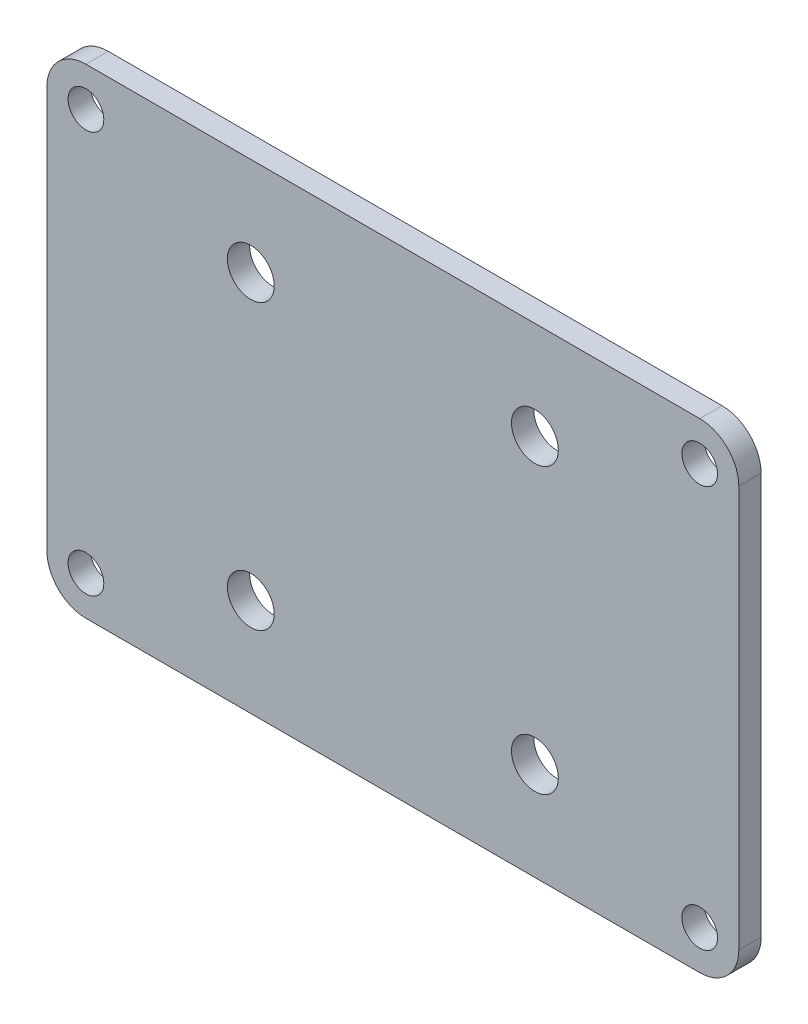
ISO-10303-21;
HEADER;
FILE_DESCRIPTION(('STEP AP214'),'2;1');
FILE_NAME('part.step','',(''),(''),'','','');
FILE_SCHEMA(('AUTOMOTIVE_DESIGN { 1 0 10303 214 1 1 1 1 }'));
ENDSEC;
DATA;
#1=APPLICATION_CONTEXT('core data for automotive mechanical design processes');
#2=APPLICATION_PROTOCOL_DEFINITION('international standard','automotive_design',2000,#1);
#3=PRODUCT_CONTEXT('',#1,'mechanical');
#4=PRODUCT('Part','Part','',(#3));
#5=PRODUCT_RELATED_PRODUCT_CATEGORY('part','',(#4));
#6=PRODUCT_DEFINITION_FORMATION('','',#4);
#7=PRODUCT_DEFINITION_CONTEXT('part definition',#1,'design');
#8=PRODUCT_DEFINITION('design','',#6,#7);
#9=PRODUCT_DEFINITION_SHAPE('','',#8);
#10=(LENGTH_UNIT() NAMED_UNIT(*) SI_UNIT(.MILLI.,.METRE.));
#11=(NAMED_UNIT(*) PLANE_ANGLE_UNIT() SI_UNIT($,.RADIAN.));
#12=(NAMED_UNIT(*) SI_UNIT($,.STERADIAN.) SOLID_ANGLE_UNIT());
#13=UNCERTAINTY_MEASURE_WITH_UNIT(LENGTH_MEASURE(1.E-05),#10,'distance_accuracy_value','');
#14=(GEOMETRIC_REPRESENTATION_CONTEXT(3) GLOBAL_UNCERTAINTY_ASSIGNED_CONTEXT((#13)) GLOBAL_UNIT_ASSIGNED_CONTEXT((#10,
#11,#12)) REPRESENTATION_CONTEXT('',''));
#15=CARTESIAN_POINT('',(0.,0.,0.));
#16=DIRECTION('',(0.,0.,1.));
#17=DIRECTION('',(1.,0.,0.));
#18=AXIS2_PLACEMENT_3D('',#15,#16,#17);
#19=CARTESIAN_POINT('',(0.,0.,2.));
#20=DIRECTION('',(0.,0.,-1.));
#21=DIRECTION('',(-1.,0.,0.));
#22=AXIS2_PLACEMENT_3D('',#19,#20,#21);
#23=PLANE('',#22);
#24=CARTESIAN_POINT('',(-12.7279220613579,12.7279220613578,2.));
#25=DIRECTION('',(0.,0.,1.));
#26=DIRECTION('',(1.,0.,0.));
#27=AXIS2_PLACEMENT_3D('',#24,#25,#26);
#28=CIRCLE('',#27,2.1);
#29=CARTESIAN_POINT('',(-10.6279220613579,12.7279220613578,2.));
#30=VERTEX_POINT('',#29);
#31=EDGE_CURVE('E11',#30,#30,#28,.T.);
#32=ORIENTED_EDGE('',*,*,#31,.F.);
#33=EDGE_LOOP('',(#32));
#34=FACE_BOUND('',#33,.T.);
#35=CARTESIAN_POINT('',(-27.5,-18.,2.));
#36=DIRECTION('',(0.,0.,1.));
#37=DIRECTION('',(1.,0.,0.));
#38=AXIS2_PLACEMENT_3D('',#35,#36,#37);
#39=CIRCLE('',#38,1.6);
#40=CARTESIAN_POINT('',(-25.9,-18.,2.));
#41=VERTEX_POINT('',#40);
#42=EDGE_CURVE('E24',#41,#41,#39,.T.);
#43=ORIENTED_EDGE('',*,*,#42,.F.);
#44=EDGE_LOOP('',(#43));
#45=FACE_BOUND('',#44,.T.);
#46=CARTESIAN_POINT('',(27.5,-18.,2.));
#47=DIRECTION('',(0.,0.,1.));
#48=DIRECTION('',(1.,0.,0.));
#49=AXIS2_PLACEMENT_3D('',#46,#47,#48);
#50=CIRCLE('',#49,1.6);
#51=CARTESIAN_POINT('',(29.1,-18.,2.));
#52=VERTEX_POINT('',#51);
#53=EDGE_CURVE('E179',#52,#52,#50,.T.);
#54=ORIENTED_EDGE('',*,*,#53,.F.);
#55=EDGE_LOOP('',(#54));
#56=FACE_BOUND('',#55,.T.);
#57=CARTESIAN_POINT('',(27.5,18.,2.));
#58=DIRECTION('',(0.,0.,1.));
#59=DIRECTION('',(1.,0.,0.));
#60=AXIS2_PLACEMENT_3D('',#57,#58,#59);
#61=CIRCLE('',#60,1.6);
#62=CARTESIAN_POINT('',(29.1,18.,2.));
#63=VERTEX_POINT('',#62);
#64=EDGE_CURVE('E176',#63,#63,#61,.T.);
#65=ORIENTED_EDGE('',*,*,#64,.F.);
#66=EDGE_LOOP('',(#65));
#67=FACE_BOUND('',#66,.T.);
#68=CARTESIAN_POINT('',(-27.5,18.,2.));
#69=DIRECTION('',(0.,0.,1.));
#70=DIRECTION('',(1.,0.,0.));
#71=AXIS2_PLACEMENT_3D('',#68,#69,#70);
#72=CIRCLE('',#71,1.6);
#73=CARTESIAN_POINT('',(-25.9,18.,2.));
#74=VERTEX_POINT('',#73);
#75=EDGE_CURVE('E173',#74,#74,#72,.T.);
#76=ORIENTED_EDGE('',*,*,#75,.F.);
#77=EDGE_LOOP('',(#76));
#78=FACE_BOUND('',#77,.T.);
#79=CARTESIAN_POINT('',(-12.7279220613579,-12.7279220613578,2.));
#80=DIRECTION('',(0.,0.,1.));
#81=DIRECTION('',(1.,0.,0.));
#82=AXIS2_PLACEMENT_3D('',#79,#80,#81);
#83=CIRCLE('',#82,2.1);
#84=CARTESIAN_POINT('',(-10.6279220613579,-12.7279220613578,2.));
#85=VERTEX_POINT('',#84);
#86=EDGE_CURVE('E170',#85,#85,#83,.T.);
#87=ORIENTED_EDGE('',*,*,#86,.F.);
#88=EDGE_LOOP('',(#87));
#89=FACE_BOUND('',#88,.T.);
#90=CARTESIAN_POINT('',(12.7279220613579,-12.7279220613578,2.));
#91=DIRECTION('',(0.,0.,1.));
#92=DIRECTION('',(1.,0.,0.));
#93=AXIS2_PLACEMENT_3D('',#90,#91,#92);
#94=CIRCLE('',#93,2.1);
#95=CARTESIAN_POINT('',(14.8279220613579,-12.7279220613578,2.));
#96=VERTEX_POINT('',#95);
#97=EDGE_CURVE('E167',#96,#96,#94,.T.);
#98=ORIENTED_EDGE('',*,*,#97,.F.);
#99=EDGE_LOOP('',(#98));
#100=FACE_BOUND('',#99,.T.);
#101=CARTESIAN_POINT('',(12.7279220613579,12.7279220613578,2.));
#102=DIRECTION('',(0.,0.,1.));
#103=DIRECTION('',(1.,0.,0.));
#104=AXIS2_PLACEMENT_3D('',#101,#102,#103);
#105=CIRCLE('',#104,2.1);
#106=CARTESIAN_POINT('',(14.8279220613579,12.7279220613578,2.));
#107=VERTEX_POINT('',#106);
#108=EDGE_CURVE('E164',#107,#107,#105,.T.);
#109=ORIENTED_EDGE('',*,*,#108,.F.);
#110=EDGE_LOOP('',(#109));
#111=FACE_BOUND('',#110,.T.);
#112=DIRECTION('',(0.,-1.,0.));
#113=VECTOR('',#112,1.);
#114=CARTESIAN_POINT('',(-31.,0.,2.));
#115=LINE('',#114,#113);
#116=CARTESIAN_POINT('',(-31.,18.,2.));
#117=VERTEX_POINT('',#116);
#118=CARTESIAN_POINT('',(-31.,-18.,2.));
#119=VERTEX_POINT('',#118);
#120=EDGE_CURVE('E31',#117,#119,#115,.T.);
#121=ORIENTED_EDGE('',*,*,#120,.T.);
#122=CARTESIAN_POINT('',(-27.5,-18.,2.));
#123=DIRECTION('',(0.,0.,-1.));
#124=DIRECTION('',(-1.,0.,0.));
#125=AXIS2_PLACEMENT_3D('',#122,#123,#124);
#126=CIRCLE('',#125,3.5);
#127=CARTESIAN_POINT('',(-27.5,-21.5,2.));
#128=VERTEX_POINT('',#127);
#129=EDGE_CURVE('E36',#119,#128,#126,.F.);
#130=ORIENTED_EDGE('',*,*,#129,.T.);
#131=DIRECTION('',(-1.,0.,0.));
#132=VECTOR('',#131,1.);
#133=CARTESIAN_POINT('',(0.,-21.5,2.));
#134=LINE('',#133,#132);
#135=CARTESIAN_POINT('',(27.5,-21.5,2.));
#136=VERTEX_POINT('',#135);
#137=EDGE_CURVE('E160',#136,#128,#134,.T.);
#138=ORIENTED_EDGE('',*,*,#137,.F.);
#139=CARTESIAN_POINT('',(27.5,-18.,2.));
#140=DIRECTION('',(0.,0.,-1.));
#141=DIRECTION('',(-1.,0.,0.));
#142=AXIS2_PLACEMENT_3D('',#139,#140,#141);
#143=CIRCLE('',#142,3.5);
#144=CARTESIAN_POINT('',(31.,-18.,2.));
#145=VERTEX_POINT('',#144);
#146=EDGE_CURVE('E104',#136,#145,#143,.F.);
#147=ORIENTED_EDGE('',*,*,#146,.T.);
#148=DIRECTION('',(0.,-1.,0.));
#149=VECTOR('',#148,1.);
#150=CARTESIAN_POINT('',(31.,0.,2.));
#151=LINE('',#150,#149);
#152=CARTESIAN_POINT('',(31.,18.,2.));
#153=VERTEX_POINT('',#152);
#154=EDGE_CURVE('E156',#153,#145,#151,.T.);
#155=ORIENTED_EDGE('',*,*,#154,.F.);
#156=CARTESIAN_POINT('',(27.5,18.,2.));
#157=DIRECTION('',(0.,0.,-1.));
#158=DIRECTION('',(-1.,0.,0.));
#159=AXIS2_PLACEMENT_3D('',#156,#157,#158);
#160=CIRCLE('',#159,3.5);
#161=CARTESIAN_POINT('',(27.5,21.5,2.));
#162=VERTEX_POINT('',#161);
#163=EDGE_CURVE('E154',#153,#162,#160,.F.);
#164=ORIENTED_EDGE('',*,*,#163,.T.);
#165=DIRECTION('',(-1.,0.,0.));
#166=VECTOR('',#165,1.);
#167=CARTESIAN_POINT('',(0.,21.5,2.));
#168=LINE('',#167,#166);
#169=CARTESIAN_POINT('',(-27.5,21.5,2.));
#170=VERTEX_POINT('',#169);
#171=EDGE_CURVE('E152',#162,#170,#168,.T.);
#172=ORIENTED_EDGE('',*,*,#171,.T.);
#173=CARTESIAN_POINT('',(-27.5,18.,2.));
#174=DIRECTION('',(0.,0.,-1.));
#175=DIRECTION('',(-1.,0.,0.));
#176=AXIS2_PLACEMENT_3D('',#173,#174,#175);
#177=CIRCLE('',#176,3.5);
#178=EDGE_CURVE('E150',#170,#117,#177,.F.);
#179=ORIENTED_EDGE('',*,*,#178,.T.);
#180=EDGE_LOOP('',(#121,#130,#138,#147,#155,#164,#172,#179));
#181=FACE_BOUND('',#180,.T.);
#182=ADVANCED_FACE('F17',(#34,#45,#56,#67,#78,#89,#100,#111,#181),#23,.F.);
#183=CARTESIAN_POINT('',(0.,0.,0.));
#184=DIRECTION('',(0.,0.,-1.));
#185=DIRECTION('',(-1.,0.,0.));
#186=AXIS2_PLACEMENT_3D('',#183,#184,#185);
#187=PLANE('',#186);
#188=CARTESIAN_POINT('',(-12.7279220613579,12.7279220613578,0.));
#189=DIRECTION('',(0.,0.,1.));
#190=DIRECTION('',(1.,0.,0.));
#191=AXIS2_PLACEMENT_3D('',#188,#189,#190);
#192=CIRCLE('',#191,2.1);
#193=CARTESIAN_POINT('',(-10.6279220613579,12.7279220613578,0.));
#194=VERTEX_POINT('',#193);
#195=EDGE_CURVE('E147',#194,#194,#192,.T.);
#196=ORIENTED_EDGE('',*,*,#195,.T.);
#197=EDGE_LOOP('',(#196));
#198=FACE_BOUND('',#197,.T.);
#199=CARTESIAN_POINT('',(-27.5,-18.,0.));
#200=DIRECTION('',(0.,0.,1.));
#201=DIRECTION('',(1.,0.,0.));
#202=AXIS2_PLACEMENT_3D('',#199,#200,#201);
#203=CIRCLE('',#202,1.6);
#204=CARTESIAN_POINT('',(-25.9,-18.,0.));
#205=VERTEX_POINT('',#204);
#206=EDGE_CURVE('E144',#205,#205,#203,.T.);
#207=ORIENTED_EDGE('',*,*,#206,.T.);
#208=EDGE_LOOP('',(#207));
#209=FACE_BOUND('',#208,.T.);
#210=CARTESIAN_POINT('',(27.5,-18.,0.));
#211=DIRECTION('',(0.,0.,1.));
#212=DIRECTION('',(1.,0.,0.));
#213=AXIS2_PLACEMENT_3D('',#210,#211,#212);
#214=CIRCLE('',#213,1.6);
#215=CARTESIAN_POINT('',(29.1,-18.,0.));
#216=VERTEX_POINT('',#215);
#217=EDGE_CURVE('E141',#216,#216,#214,.T.);
#218=ORIENTED_EDGE('',*,*,#217,.T.);
#219=EDGE_LOOP('',(#218));
#220=FACE_BOUND('',#219,.T.);
#221=CARTESIAN_POINT('',(27.5,18.,0.));
#222=DIRECTION('',(0.,0.,1.));
#223=DIRECTION('',(1.,0.,0.));
#224=AXIS2_PLACEMENT_3D('',#221,#222,#223);
#225=CIRCLE('',#224,1.6);
#226=CARTESIAN_POINT('',(29.1,18.,0.));
#227=VERTEX_POINT('',#226);
#228=EDGE_CURVE('E138',#227,#227,#225,.T.);
#229=ORIENTED_EDGE('',*,*,#228,.T.);
#230=EDGE_LOOP('',(#229));
#231=FACE_BOUND('',#230,.T.);
#232=CARTESIAN_POINT('',(-27.5,18.,0.));
#233=DIRECTION('',(0.,0.,1.));
#234=DIRECTION('',(1.,0.,0.));
#235=AXIS2_PLACEMENT_3D('',#232,#233,#234);
#236=CIRCLE('',#235,1.6);
#237=CARTESIAN_POINT('',(-25.9,18.,0.));
#238=VERTEX_POINT('',#237);
#239=EDGE_CURVE('E135',#238,#238,#236,.T.);
#240=ORIENTED_EDGE('',*,*,#239,.T.);
#241=EDGE_LOOP('',(#240));
#242=FACE_BOUND('',#241,.T.);
#243=CARTESIAN_POINT('',(-12.7279220613579,-12.7279220613578,0.));
#244=DIRECTION('',(0.,0.,1.));
#245=DIRECTION('',(1.,0.,0.));
#246=AXIS2_PLACEMENT_3D('',#243,#244,#245);
#247=CIRCLE('',#246,2.1);
#248=CARTESIAN_POINT('',(-10.6279220613579,-12.7279220613578,0.));
#249=VERTEX_POINT('',#248);
#250=EDGE_CURVE('E132',#249,#249,#247,.T.);
#251=ORIENTED_EDGE('',*,*,#250,.T.);
#252=EDGE_LOOP('',(#251));
#253=FACE_BOUND('',#252,.T.);
#254=CARTESIAN_POINT('',(12.7279220613579,-12.7279220613578,0.));
#255=DIRECTION('',(0.,0.,1.));
#256=DIRECTION('',(1.,0.,0.));
#257=AXIS2_PLACEMENT_3D('',#254,#255,#256);
#258=CIRCLE('',#257,2.1);
#259=CARTESIAN_POINT('',(14.8279220613579,-12.7279220613578,0.));
#260=VERTEX_POINT('',#259);
#261=EDGE_CURVE('E129',#260,#260,#258,.T.);
#262=ORIENTED_EDGE('',*,*,#261,.T.);
#263=EDGE_LOOP('',(#262));
#264=FACE_BOUND('',#263,.T.);
#265=CARTESIAN_POINT('',(12.7279220613579,12.7279220613578,0.));
#266=DIRECTION('',(0.,0.,1.));
#267=DIRECTION('',(1.,0.,0.));
#268=AXIS2_PLACEMENT_3D('',#265,#266,#267);
#269=CIRCLE('',#268,2.1);
#270=CARTESIAN_POINT('',(14.8279220613579,12.7279220613578,0.));
#271=VERTEX_POINT('',#270);
#272=EDGE_CURVE('E100',#271,#271,#269,.T.);
#273=ORIENTED_EDGE('',*,*,#272,.T.);
#274=EDGE_LOOP('',(#273));
#275=FACE_BOUND('',#274,.T.);
#276=DIRECTION('',(1.,0.,0.));
#277=VECTOR('',#276,1.);
#278=CARTESIAN_POINT('',(0.,-21.5,0.));
#279=LINE('',#278,#277);
#280=CARTESIAN_POINT('',(-27.5,-21.5,0.));
#281=VERTEX_POINT('',#280);
#282=CARTESIAN_POINT('',(27.5,-21.5,0.));
#283=VERTEX_POINT('',#282);
#284=EDGE_CURVE('E82',#281,#283,#279,.T.);
#285=ORIENTED_EDGE('',*,*,#284,.F.);
#286=CARTESIAN_POINT('',(-27.5,-18.,0.));
#287=DIRECTION('',(0.,0.,-1.));
#288=DIRECTION('',(-1.,0.,0.));
#289=AXIS2_PLACEMENT_3D('',#286,#287,#288);
#290=CIRCLE('',#289,3.5);
#291=CARTESIAN_POINT('',(-31.,-18.,0.));
#292=VERTEX_POINT('',#291);
#293=EDGE_CURVE('E101',#281,#292,#290,.T.);
#294=ORIENTED_EDGE('',*,*,#293,.T.);
#295=DIRECTION('',(0.,1.,0.));
#296=VECTOR('',#295,1.);
#297=CARTESIAN_POINT('',(-31.,0.,0.));
#298=LINE('',#297,#296);
#299=CARTESIAN_POINT('',(-31.,18.,0.));
#300=VERTEX_POINT('',#299);
#301=EDGE_CURVE('E124',#292,#300,#298,.T.);
#302=ORIENTED_EDGE('',*,*,#301,.T.);
#303=CARTESIAN_POINT('',(-27.5,18.,0.));
#304=DIRECTION('',(0.,0.,-1.));
#305=DIRECTION('',(-1.,0.,0.));
#306=AXIS2_PLACEMENT_3D('',#303,#304,#305);
#307=CIRCLE('',#306,3.5);
#308=CARTESIAN_POINT('',(-27.5,21.5,0.));
#309=VERTEX_POINT('',#308);
#310=EDGE_CURVE('E122',#300,#309,#307,.T.);
#311=ORIENTED_EDGE('',*,*,#310,.T.);
#312=DIRECTION('',(1.,0.,0.));
#313=VECTOR('',#312,1.);
#314=CARTESIAN_POINT('',(0.,21.5,0.));
#315=LINE('',#314,#313);
#316=CARTESIAN_POINT('',(27.5,21.5,0.));
#317=VERTEX_POINT('',#316);
#318=EDGE_CURVE('E120',#309,#317,#315,.T.);
#319=ORIENTED_EDGE('',*,*,#318,.T.);
#320=CARTESIAN_POINT('',(27.5,18.,0.));
#321=DIRECTION('',(0.,0.,-1.));
#322=DIRECTION('',(-1.,0.,0.));
#323=AXIS2_PLACEMENT_3D('',#320,#321,#322);
#324=CIRCLE('',#323,3.5);
#325=CARTESIAN_POINT('',(31.,18.,0.));
#326=VERTEX_POINT('',#325);
#327=EDGE_CURVE('E118',#317,#326,#324,.T.);
#328=ORIENTED_EDGE('',*,*,#327,.T.);
#329=DIRECTION('',(0.,1.,0.));
#330=VECTOR('',#329,1.);
#331=CARTESIAN_POINT('',(31.,0.,0.));
#332=LINE('',#331,#330);
#333=CARTESIAN_POINT('',(31.,-18.,0.));
#334=VERTEX_POINT('',#333);
#335=EDGE_CURVE('E85',#334,#326,#332,.T.);
#336=ORIENTED_EDGE('',*,*,#335,.F.);
#337=CARTESIAN_POINT('',(27.5,-18.,0.));
#338=DIRECTION('',(0.,0.,-1.));
#339=DIRECTION('',(-1.,0.,0.));
#340=AXIS2_PLACEMENT_3D('',#337,#338,#339);
#341=CIRCLE('',#340,3.5);
#342=EDGE_CURVE('E79',#334,#283,#341,.T.);
#343=ORIENTED_EDGE('',*,*,#342,.T.);
#344=EDGE_LOOP('',(#285,#294,#302,#311,#319,#328,#336,#343));
#345=FACE_BOUND('',#344,.T.);
#346=ADVANCED_FACE('F81',(#198,#209,#220,#231,#242,#253,#264,#275,#345),#187,.T.);
#347=CARTESIAN_POINT('',(-12.7279220613579,12.7279220613578,0.));
#348=DIRECTION('',(0.,0.,1.));
#349=DIRECTION('',(1.,0.,0.));
#350=AXIS2_PLACEMENT_3D('',#347,#348,#349);
#351=CYLINDRICAL_SURFACE('',#350,2.1);
#352=ORIENTED_EDGE('',*,*,#195,.F.);
#353=EDGE_LOOP('',(#352));
#354=FACE_BOUND('',#353,.T.);
#355=ORIENTED_EDGE('',*,*,#31,.T.);
#356=EDGE_LOOP('',(#355));
#357=FACE_BOUND('',#356,.T.);
#358=ADVANCED_FACE('F237',(#354,#357),#351,.F.);
#359=CARTESIAN_POINT('',(-27.5,-18.,0.));
#360=DIRECTION('',(0.,0.,1.));
#361=DIRECTION('',(1.,0.,0.));
#362=AXIS2_PLACEMENT_3D('',#359,#360,#361);
#363=CYLINDRICAL_SURFACE('',#362,1.6);
#364=ORIENTED_EDGE('',*,*,#206,.F.);
#365=EDGE_LOOP('',(#364));
#366=FACE_BOUND('',#365,.T.);
#367=ORIENTED_EDGE('',*,*,#42,.T.);
#368=EDGE_LOOP('',(#367));
#369=FACE_BOUND('',#368,.T.);
#370=ADVANCED_FACE('F184',(#366,#369),#363,.F.);
#371=CARTESIAN_POINT('',(27.5,-18.,0.));
#372=DIRECTION('',(0.,0.,1.));
#373=DIRECTION('',(1.,0.,0.));
#374=AXIS2_PLACEMENT_3D('',#371,#372,#373);
#375=CYLINDRICAL_SURFACE('',#374,1.6);
#376=ORIENTED_EDGE('',*,*,#217,.F.);
#377=EDGE_LOOP('',(#376));
#378=FACE_BOUND('',#377,.T.);
#379=ORIENTED_EDGE('',*,*,#53,.T.);
#380=EDGE_LOOP('',(#379));
#381=FACE_BOUND('',#380,.T.);
#382=ADVANCED_FACE('F230',(#378,#381),#375,.F.);
#383=CARTESIAN_POINT('',(27.5,18.,0.));
#384=DIRECTION('',(0.,0.,1.));
#385=DIRECTION('',(1.,0.,0.));
#386=AXIS2_PLACEMENT_3D('',#383,#384,#385);
#387=CYLINDRICAL_SURFACE('',#386,1.6);
#388=ORIENTED_EDGE('',*,*,#228,.F.);
#389=EDGE_LOOP('',(#388));
#390=FACE_BOUND('',#389,.T.);
#391=ORIENTED_EDGE('',*,*,#64,.T.);
#392=EDGE_LOOP('',(#391));
#393=FACE_BOUND('',#392,.T.);
#394=ADVANCED_FACE('F226',(#390,#393),#387,.F.);
#395=CARTESIAN_POINT('',(-27.5,18.,0.));
#396=DIRECTION('',(0.,0.,1.));
#397=DIRECTION('',(1.,0.,0.));
#398=AXIS2_PLACEMENT_3D('',#395,#396,#397);
#399=CYLINDRICAL_SURFACE('',#398,1.6);
#400=ORIENTED_EDGE('',*,*,#239,.F.);
#401=EDGE_LOOP('',(#400));
#402=FACE_BOUND('',#401,.T.);
#403=ORIENTED_EDGE('',*,*,#75,.T.);
#404=EDGE_LOOP('',(#403));
#405=FACE_BOUND('',#404,.T.);
#406=ADVANCED_FACE('F222',(#402,#405),#399,.F.);
#407=CARTESIAN_POINT('',(-12.7279220613579,-12.7279220613578,0.));
#408=DIRECTION('',(0.,0.,1.));
#409=DIRECTION('',(1.,0.,0.));
#410=AXIS2_PLACEMENT_3D('',#407,#408,#409);
#411=CYLINDRICAL_SURFACE('',#410,2.1);
#412=ORIENTED_EDGE('',*,*,#250,.F.);
#413=EDGE_LOOP('',(#412));
#414=FACE_BOUND('',#413,.T.);
#415=ORIENTED_EDGE('',*,*,#86,.T.);
#416=EDGE_LOOP('',(#415));
#417=FACE_BOUND('',#416,.T.);
#418=ADVANCED_FACE('F214',(#414,#417),#411,.F.);
#419=CARTESIAN_POINT('',(12.7279220613579,-12.7279220613578,0.));
#420=DIRECTION('',(0.,0.,1.));
#421=DIRECTION('',(1.,0.,0.));
#422=AXIS2_PLACEMENT_3D('',#419,#420,#421);
#423=CYLINDRICAL_SURFACE('',#422,2.1);
#424=ORIENTED_EDGE('',*,*,#261,.F.);
#425=EDGE_LOOP('',(#424));
#426=FACE_BOUND('',#425,.T.);
#427=ORIENTED_EDGE('',*,*,#97,.T.);
#428=EDGE_LOOP('',(#427));
#429=FACE_BOUND('',#428,.T.);
#430=ADVANCED_FACE('F204',(#426,#429),#423,.F.);
#431=CARTESIAN_POINT('',(12.7279220613579,12.7279220613578,0.));
#432=DIRECTION('',(0.,0.,1.));
#433=DIRECTION('',(1.,0.,0.));
#434=AXIS2_PLACEMENT_3D('',#431,#432,#433);
#435=CYLINDRICAL_SURFACE('',#434,2.1);
#436=ORIENTED_EDGE('',*,*,#272,.F.);
#437=EDGE_LOOP('',(#436));
#438=FACE_BOUND('',#437,.T.);
#439=ORIENTED_EDGE('',*,*,#108,.T.);
#440=EDGE_LOOP('',(#439));
#441=FACE_BOUND('',#440,.T.);
#442=ADVANCED_FACE('F201',(#438,#441),#435,.F.);
#443=CARTESIAN_POINT('',(-31.,0.,-8.));
#444=DIRECTION('',(-1.,0.,0.));
#445=DIRECTION('',(0.,0.,1.));
#446=AXIS2_PLACEMENT_3D('',#443,#444,#445);
#447=PLANE('',#446);
#448=ORIENTED_EDGE('',*,*,#301,.F.);
#449=DIRECTION('',(0.,0.,1.));
#450=VECTOR('',#449,1.);
#451=CARTESIAN_POINT('',(-31.,-18.,2.));
#452=LINE('',#451,#450);
#453=EDGE_CURVE('E90',#292,#119,#452,.T.);
#454=ORIENTED_EDGE('',*,*,#453,.T.);
#455=ORIENTED_EDGE('',*,*,#120,.F.);
#456=DIRECTION('',(0.,0.,1.));
#457=VECTOR('',#456,1.);
#458=CARTESIAN_POINT('',(-31.,18.,-8.));
#459=LINE('',#458,#457);
#460=EDGE_CURVE('E107',#117,#300,#459,.F.);
#461=ORIENTED_EDGE('',*,*,#460,.T.);
#462=EDGE_LOOP('',(#448,#454,#455,#461));
#463=FACE_BOUND('',#462,.T.);
#464=ADVANCED_FACE('F203',(#463),#447,.T.);
#465=CARTESIAN_POINT('',(0.,-21.5,-8.));
#466=DIRECTION('',(0.,1.,0.));
#467=DIRECTION('',(0.,0.,1.));
#468=AXIS2_PLACEMENT_3D('',#465,#466,#467);
#469=PLANE('',#468);
#470=ORIENTED_EDGE('',*,*,#137,.T.);
#471=DIRECTION('',(0.,0.,1.));
#472=VECTOR('',#471,1.);
#473=CARTESIAN_POINT('',(-27.5,-21.5,0.));
#474=LINE('',#473,#472);
#475=EDGE_CURVE('E98',#128,#281,#474,.F.);
#476=ORIENTED_EDGE('',*,*,#475,.T.);
#477=ORIENTED_EDGE('',*,*,#284,.T.);
#478=DIRECTION('',(0.,0.,1.));
#479=VECTOR('',#478,1.);
#480=CARTESIAN_POINT('',(27.5,-21.5,-8.));
#481=LINE('',#480,#479);
#482=EDGE_CURVE('E95',#283,#136,#481,.T.);
#483=ORIENTED_EDGE('',*,*,#482,.T.);
#484=EDGE_LOOP('',(#470,#476,#477,#483));
#485=FACE_BOUND('',#484,.T.);
#486=ADVANCED_FACE('F94',(#485),#469,.F.);
#487=CARTESIAN_POINT('',(31.,0.,-8.));
#488=DIRECTION('',(-1.,0.,0.));
#489=DIRECTION('',(0.,0.,1.));
#490=AXIS2_PLACEMENT_3D('',#487,#488,#489);
#491=PLANE('',#490);
#492=ORIENTED_EDGE('',*,*,#335,.T.);
#493=DIRECTION('',(0.,0.,1.));
#494=VECTOR('',#493,1.);
#495=CARTESIAN_POINT('',(31.,18.,2.));
#496=LINE('',#495,#494);
#497=EDGE_CURVE('E105',#326,#153,#496,.T.);
#498=ORIENTED_EDGE('',*,*,#497,.T.);
#499=ORIENTED_EDGE('',*,*,#154,.T.);
#500=DIRECTION('',(0.,0.,1.));
#501=VECTOR('',#500,1.);
#502=CARTESIAN_POINT('',(31.,-18.,-8.));
#503=LINE('',#502,#501);
#504=EDGE_CURVE('E110',#145,#334,#503,.F.);
#505=ORIENTED_EDGE('',*,*,#504,.T.);
#506=EDGE_LOOP('',(#492,#498,#499,#505));
#507=FACE_BOUND('',#506,.T.);
#508=ADVANCED_FACE('F333',(#507),#491,.F.);
#509=CARTESIAN_POINT('',(0.,21.5,-8.));
#510=DIRECTION('',(0.,1.,0.));
#511=DIRECTION('',(0.,0.,1.));
#512=AXIS2_PLACEMENT_3D('',#509,#510,#511);
#513=PLANE('',#512);
#514=ORIENTED_EDGE('',*,*,#318,.F.);
#515=DIRECTION('',(0.,0.,1.));
#516=VECTOR('',#515,1.);
#517=CARTESIAN_POINT('',(-27.5,21.5,-8.));
#518=LINE('',#517,#516);
#519=EDGE_CURVE('E450',#309,#170,#518,.T.);
#520=ORIENTED_EDGE('',*,*,#519,.T.);
#521=ORIENTED_EDGE('',*,*,#171,.F.);
#522=DIRECTION('',(0.,0.,1.));
#523=VECTOR('',#522,1.);
#524=CARTESIAN_POINT('',(27.5,21.5,0.));
#525=LINE('',#524,#523);
#526=EDGE_CURVE('E448',#162,#317,#525,.F.);
#527=ORIENTED_EDGE('',*,*,#526,.T.);
#528=EDGE_LOOP('',(#514,#520,#521,#527));
#529=FACE_BOUND('',#528,.T.);
#530=ADVANCED_FACE('F342',(#529),#513,.T.);
#531=CARTESIAN_POINT('',(-27.5,-18.,-8.));
#532=DIRECTION('',(0.,0.,-1.));
#533=DIRECTION('',(-1.,0.,0.));
#534=AXIS2_PLACEMENT_3D('',#531,#532,#533);
#535=CYLINDRICAL_SURFACE('',#534,3.5);
#536=ORIENTED_EDGE('',*,*,#293,.F.);
#537=ORIENTED_EDGE('',*,*,#475,.F.);
#538=ORIENTED_EDGE('',*,*,#129,.F.);
#539=ORIENTED_EDGE('',*,*,#453,.F.);
#540=EDGE_LOOP('',(#536,#537,#538,#539));
#541=FACE_BOUND('',#540,.T.);
#542=ADVANCED_FACE('F353',(#541),#535,.T.);
#543=CARTESIAN_POINT('',(-27.5,18.,-8.));
#544=DIRECTION('',(0.,0.,1.));
#545=DIRECTION('',(1.,0.,0.));
#546=AXIS2_PLACEMENT_3D('',#543,#544,#545);
#547=CYLINDRICAL_SURFACE('',#546,3.5);
#548=ORIENTED_EDGE('',*,*,#310,.F.);
#549=ORIENTED_EDGE('',*,*,#460,.F.);
#550=ORIENTED_EDGE('',*,*,#178,.F.);
#551=ORIENTED_EDGE('',*,*,#519,.F.);
#552=EDGE_LOOP('',(#548,#549,#550,#551));
#553=FACE_BOUND('',#552,.T.);
#554=ADVANCED_FACE('F364',(#553),#547,.T.);
#555=CARTESIAN_POINT('',(27.5,18.,-8.));
#556=DIRECTION('',(0.,0.,-1.));
#557=DIRECTION('',(-1.,0.,0.));
#558=AXIS2_PLACEMENT_3D('',#555,#556,#557);
#559=CYLINDRICAL_SURFACE('',#558,3.5);
#560=ORIENTED_EDGE('',*,*,#327,.F.);
#561=ORIENTED_EDGE('',*,*,#526,.F.);
#562=ORIENTED_EDGE('',*,*,#163,.F.);
#563=ORIENTED_EDGE('',*,*,#497,.F.);
#564=EDGE_LOOP('',(#560,#561,#562,#563));
#565=FACE_BOUND('',#564,.T.);
#566=ADVANCED_FACE('F375',(#565),#559,.T.);
#567=CARTESIAN_POINT('',(27.5,-18.,-8.));
#568=DIRECTION('',(0.,0.,1.));
#569=DIRECTION('',(1.,0.,0.));
#570=AXIS2_PLACEMENT_3D('',#567,#568,#569);
#571=CYLINDRICAL_SURFACE('',#570,3.5);
#572=ORIENTED_EDGE('',*,*,#342,.F.);
#573=ORIENTED_EDGE('',*,*,#504,.F.);
#574=ORIENTED_EDGE('',*,*,#146,.F.);
#575=ORIENTED_EDGE('',*,*,#482,.F.);
#576=EDGE_LOOP('',(#572,#573,#574,#575));
#577=FACE_BOUND('',#576,.T.);
#578=ADVANCED_FACE('F103',(#577),#571,.T.);
#579=CLOSED_SHELL('',(#182,#346,#358,#370,#382,#394,#406,#418,#430,#442,#464,#486,#508,#530,
#542,#554,#566,#578));
#580=MANIFOLD_SOLID_BREP('B1',#579);
#581=ADVANCED_BREP_SHAPE_REPRESENTATION('',(#18,#580),#14);
#582=SHAPE_DEFINITION_REPRESENTATION(#9,#581);
ENDSEC;
END-ISO-10303-21;
